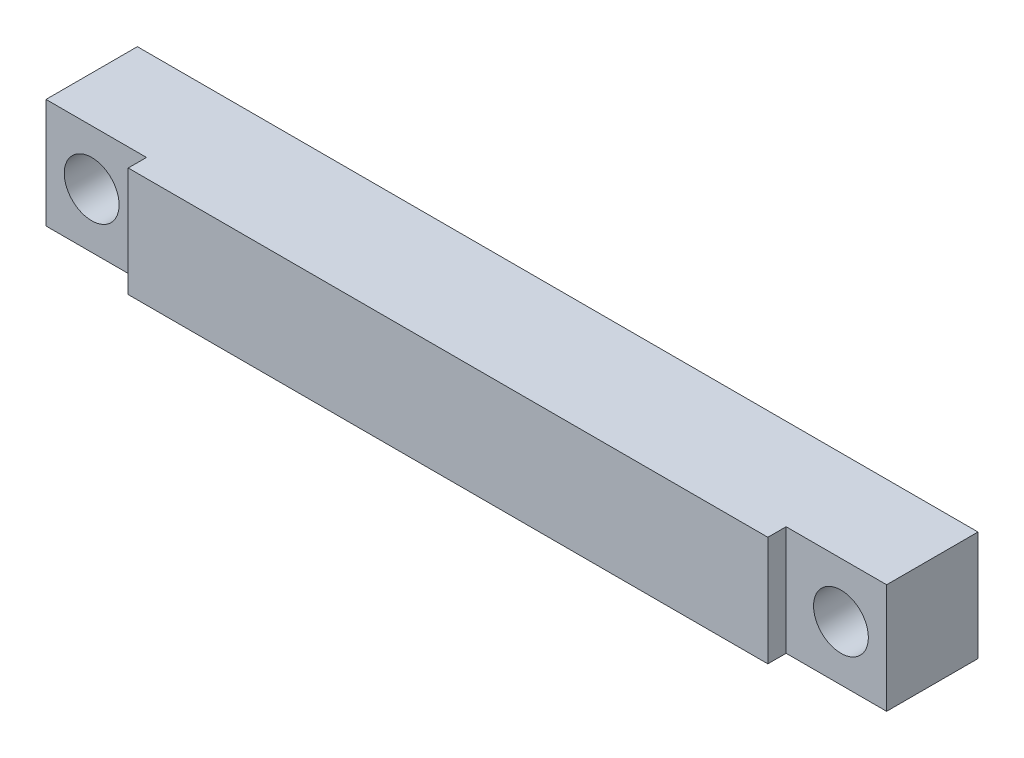
ISO-10303-21;
HEADER;
FILE_DESCRIPTION(('STEP AP214'),'2;1');
FILE_NAME('part.step','',(''),(''),'','','');
FILE_SCHEMA(('AUTOMOTIVE_DESIGN { 1 0 10303 214 1 1 1 1 }'));
ENDSEC;
DATA;
#1=APPLICATION_CONTEXT('core data for automotive mechanical design processes');
#2=APPLICATION_PROTOCOL_DEFINITION('international standard','automotive_design',2000,#1);
#3=PRODUCT_CONTEXT('',#1,'mechanical');
#4=PRODUCT('Part','Part','',(#3));
#5=PRODUCT_RELATED_PRODUCT_CATEGORY('part','',(#4));
#6=PRODUCT_DEFINITION_FORMATION('','',#4);
#7=PRODUCT_DEFINITION_CONTEXT('part definition',#1,'design');
#8=PRODUCT_DEFINITION('design','',#6,#7);
#9=PRODUCT_DEFINITION_SHAPE('','',#8);
#10=(LENGTH_UNIT() NAMED_UNIT(*) SI_UNIT(.MILLI.,.METRE.));
#11=(NAMED_UNIT(*) PLANE_ANGLE_UNIT() SI_UNIT($,.RADIAN.));
#12=(NAMED_UNIT(*) SI_UNIT($,.STERADIAN.) SOLID_ANGLE_UNIT());
#13=UNCERTAINTY_MEASURE_WITH_UNIT(LENGTH_MEASURE(1.E-05),#10,'distance_accuracy_value','');
#14=(GEOMETRIC_REPRESENTATION_CONTEXT(3) GLOBAL_UNCERTAINTY_ASSIGNED_CONTEXT((#13)) GLOBAL_UNIT_ASSIGNED_CONTEXT((#10,
#11,#12)) REPRESENTATION_CONTEXT('',''));
#15=CARTESIAN_POINT('',(0.,0.,0.));
#16=DIRECTION('',(0.,0.,1.));
#17=DIRECTION('',(1.,0.,0.));
#18=AXIS2_PLACEMENT_3D('',#15,#16,#17);
#19=CARTESIAN_POINT('',(0.,0.,5.));
#20=DIRECTION('',(0.,0.,1.));
#21=DIRECTION('',(1.,0.,0.));
#22=AXIS2_PLACEMENT_3D('',#19,#20,#21);
#23=PLANE('',#22);
#24=CARTESIAN_POINT('',(-20.5,0.,5.));
#25=DIRECTION('',(0.,0.,1.));
#26=DIRECTION('',(1.,0.,0.));
#27=AXIS2_PLACEMENT_3D('',#24,#25,#26);
#28=CIRCLE('',#27,1.5);
#29=CARTESIAN_POINT('',(-19.,0.,5.));
#30=VERTEX_POINT('',#29);
#31=EDGE_CURVE('E144',#30,#30,#28,.T.);
#32=ORIENTED_EDGE('',*,*,#31,.F.);
#33=EDGE_LOOP('',(#32));
#34=FACE_BOUND('',#33,.T.);
#35=DIRECTION('',(1.,0.,0.));
#36=VECTOR('',#35,1.);
#37=CARTESIAN_POINT('',(0.,-3.,5.));
#38=LINE('',#37,#36);
#39=CARTESIAN_POINT('',(-23.,-3.,5.));
#40=VERTEX_POINT('',#39);
#41=CARTESIAN_POINT('',(-17.5,-3.,5.));
#42=VERTEX_POINT('',#41);
#43=EDGE_CURVE('E149',#40,#42,#38,.T.);
#44=ORIENTED_EDGE('',*,*,#43,.T.);
#45=DIRECTION('',(0.,1.,0.));
#46=VECTOR('',#45,1.);
#47=CARTESIAN_POINT('',(-17.5,0.,5.));
#48=LINE('',#47,#46);
#49=CARTESIAN_POINT('',(-17.5,3.,5.));
#50=VERTEX_POINT('',#49);
#51=EDGE_CURVE('E64',#42,#50,#48,.T.);
#52=ORIENTED_EDGE('',*,*,#51,.T.);
#53=DIRECTION('',(1.,0.,0.));
#54=VECTOR('',#53,1.);
#55=CARTESIAN_POINT('',(0.,3.,5.));
#56=LINE('',#55,#54);
#57=CARTESIAN_POINT('',(-23.,3.,5.));
#58=VERTEX_POINT('',#57);
#59=EDGE_CURVE('E154',#58,#50,#56,.T.);
#60=ORIENTED_EDGE('',*,*,#59,.F.);
#61=DIRECTION('',(0.,-1.,0.));
#62=VECTOR('',#61,1.);
#63=CARTESIAN_POINT('',(-23.,0.,5.));
#64=LINE('',#63,#62);
#65=EDGE_CURVE('E156',#58,#40,#64,.T.);
#66=ORIENTED_EDGE('',*,*,#65,.T.);
#67=EDGE_LOOP('',(#44,#52,#60,#66));
#68=FACE_BOUND('',#67,.T.);
#69=ADVANCED_FACE('F41',(#34,#68),#23,.T.);
#70=CARTESIAN_POINT('',(0.,-3.,5.));
#71=DIRECTION('',(0.,1.,0.));
#72=DIRECTION('',(0.,0.,1.));
#73=AXIS2_PLACEMENT_3D('',#70,#71,#72);
#74=PLANE('',#73);
#75=CARTESIAN_POINT('',(17.5,-3.,5.));
#76=VERTEX_POINT('',#75);
#77=CARTESIAN_POINT('',(23.,-3.,5.));
#78=VERTEX_POINT('',#77);
#79=EDGE_CURVE('E147',#76,#78,#38,.T.);
#80=ORIENTED_EDGE('',*,*,#79,.F.);
#81=DIRECTION('',(0.,0.,-1.));
#82=VECTOR('',#81,1.);
#83=CARTESIAN_POINT('',(17.5,-3.,6.));
#84=LINE('',#83,#82);
#85=CARTESIAN_POINT('',(17.5,-3.,6.));
#86=VERTEX_POINT('',#85);
#87=EDGE_CURVE('E135',#86,#76,#84,.T.);
#88=ORIENTED_EDGE('',*,*,#87,.F.);
#89=DIRECTION('',(1.,0.,0.));
#90=VECTOR('',#89,1.);
#91=CARTESIAN_POINT('',(0.,-3.,6.));
#92=LINE('',#91,#90);
#93=CARTESIAN_POINT('',(-17.5,-3.,6.));
#94=VERTEX_POINT('',#93);
#95=EDGE_CURVE('E123',#94,#86,#92,.T.);
#96=ORIENTED_EDGE('',*,*,#95,.F.);
#97=DIRECTION('',(0.,0.,-1.));
#98=VECTOR('',#97,1.);
#99=CARTESIAN_POINT('',(-17.5,-3.,6.));
#100=LINE('',#99,#98);
#101=EDGE_CURVE('E137',#94,#42,#100,.T.);
#102=ORIENTED_EDGE('',*,*,#101,.T.);
#103=ORIENTED_EDGE('',*,*,#43,.F.);
#104=DIRECTION('',(0.,0.,-1.));
#105=VECTOR('',#104,1.);
#106=CARTESIAN_POINT('',(-23.,-3.,5.));
#107=LINE('',#106,#105);
#108=CARTESIAN_POINT('',(-23.,-3.,0.));
#109=VERTEX_POINT('',#108);
#110=EDGE_CURVE('E161',#40,#109,#107,.T.);
#111=ORIENTED_EDGE('',*,*,#110,.T.);
#112=DIRECTION('',(1.,0.,0.));
#113=VECTOR('',#112,1.);
#114=CARTESIAN_POINT('',(0.,-3.,0.));
#115=LINE('',#114,#113);
#116=CARTESIAN_POINT('',(23.,-3.,0.));
#117=VERTEX_POINT('',#116);
#118=EDGE_CURVE('E164',#109,#117,#115,.T.);
#119=ORIENTED_EDGE('',*,*,#118,.T.);
#120=DIRECTION('',(0.,0.,-1.));
#121=VECTOR('',#120,1.);
#122=CARTESIAN_POINT('',(23.,-3.,5.));
#123=LINE('',#122,#121);
#124=EDGE_CURVE('E11',#78,#117,#123,.T.);
#125=ORIENTED_EDGE('',*,*,#124,.F.);
#126=EDGE_LOOP('',(#80,#88,#96,#102,#103,#111,#119,#125));
#127=FACE_BOUND('',#126,.T.);
#128=ADVANCED_FACE('F195',(#127),#74,.F.);
#129=CARTESIAN_POINT('',(23.,0.,5.));
#130=DIRECTION('',(1.,0.,0.));
#131=DIRECTION('',(0.,0.,-1.));
#132=AXIS2_PLACEMENT_3D('',#129,#130,#131);
#133=PLANE('',#132);
#134=DIRECTION('',(0.,-1.,0.));
#135=VECTOR('',#134,1.);
#136=CARTESIAN_POINT('',(23.,0.,0.));
#137=LINE('',#136,#135);
#138=CARTESIAN_POINT('',(23.,3.,0.));
#139=VERTEX_POINT('',#138);
#140=EDGE_CURVE('E166',#139,#117,#137,.T.);
#141=ORIENTED_EDGE('',*,*,#140,.F.);
#142=DIRECTION('',(0.,0.,-1.));
#143=VECTOR('',#142,1.);
#144=CARTESIAN_POINT('',(23.,3.,5.));
#145=LINE('',#144,#143);
#146=CARTESIAN_POINT('',(23.,3.,5.));
#147=VERTEX_POINT('',#146);
#148=EDGE_CURVE('E49',#147,#139,#145,.T.);
#149=ORIENTED_EDGE('',*,*,#148,.F.);
#150=DIRECTION('',(0.,-1.,0.));
#151=VECTOR('',#150,1.);
#152=CARTESIAN_POINT('',(23.,0.,5.));
#153=LINE('',#152,#151);
#154=EDGE_CURVE('E151',#147,#78,#153,.T.);
#155=ORIENTED_EDGE('',*,*,#154,.T.);
#156=ORIENTED_EDGE('',*,*,#124,.T.);
#157=EDGE_LOOP('',(#141,#149,#155,#156));
#158=FACE_BOUND('',#157,.T.);
#159=ADVANCED_FACE('F182',(#158),#133,.T.);
#160=CARTESIAN_POINT('',(0.,3.,5.));
#161=DIRECTION('',(0.,1.,0.));
#162=DIRECTION('',(0.,0.,1.));
#163=AXIS2_PLACEMENT_3D('',#160,#161,#162);
#164=PLANE('',#163);
#165=ORIENTED_EDGE('',*,*,#148,.T.);
#166=DIRECTION('',(1.,0.,0.));
#167=VECTOR('',#166,1.);
#168=CARTESIAN_POINT('',(0.,3.,0.));
#169=LINE('',#168,#167);
#170=CARTESIAN_POINT('',(-23.,3.,0.));
#171=VERTEX_POINT('',#170);
#172=EDGE_CURVE('E169',#171,#139,#169,.T.);
#173=ORIENTED_EDGE('',*,*,#172,.F.);
#174=DIRECTION('',(0.,0.,-1.));
#175=VECTOR('',#174,1.);
#176=CARTESIAN_POINT('',(-23.,3.,5.));
#177=LINE('',#176,#175);
#178=EDGE_CURVE('E177',#58,#171,#177,.T.);
#179=ORIENTED_EDGE('',*,*,#178,.F.);
#180=ORIENTED_EDGE('',*,*,#59,.T.);
#181=DIRECTION('',(0.,0.,-1.));
#182=VECTOR('',#181,1.);
#183=CARTESIAN_POINT('',(-17.5,3.,6.));
#184=LINE('',#183,#182);
#185=CARTESIAN_POINT('',(-17.5,3.,6.));
#186=VERTEX_POINT('',#185);
#187=EDGE_CURVE('E116',#186,#50,#184,.T.);
#188=ORIENTED_EDGE('',*,*,#187,.F.);
#189=DIRECTION('',(1.,0.,0.));
#190=VECTOR('',#189,1.);
#191=CARTESIAN_POINT('',(0.,3.,6.));
#192=LINE('',#191,#190);
#193=CARTESIAN_POINT('',(17.5,3.,6.));
#194=VERTEX_POINT('',#193);
#195=EDGE_CURVE('E121',#186,#194,#192,.T.);
#196=ORIENTED_EDGE('',*,*,#195,.T.);
#197=DIRECTION('',(0.,0.,-1.));
#198=VECTOR('',#197,1.);
#199=CARTESIAN_POINT('',(17.5,3.,6.));
#200=LINE('',#199,#198);
#201=CARTESIAN_POINT('',(17.5,3.,5.));
#202=VERTEX_POINT('',#201);
#203=EDGE_CURVE('E108',#194,#202,#200,.T.);
#204=ORIENTED_EDGE('',*,*,#203,.T.);
#205=EDGE_CURVE('E56',#202,#147,#56,.T.);
#206=ORIENTED_EDGE('',*,*,#205,.T.);
#207=EDGE_LOOP('',(#165,#173,#179,#180,#188,#196,#204,#206));
#208=FACE_BOUND('',#207,.T.);
#209=ADVANCED_FACE('F127',(#208),#164,.T.);
#210=CARTESIAN_POINT('',(-23.,0.,5.));
#211=DIRECTION('',(1.,0.,0.));
#212=DIRECTION('',(0.,0.,-1.));
#213=AXIS2_PLACEMENT_3D('',#210,#211,#212);
#214=PLANE('',#213);
#215=DIRECTION('',(0.,-1.,0.));
#216=VECTOR('',#215,1.);
#217=CARTESIAN_POINT('',(-23.,0.,0.));
#218=LINE('',#217,#216);
#219=EDGE_CURVE('E171',#171,#109,#218,.T.);
#220=ORIENTED_EDGE('',*,*,#219,.T.);
#221=ORIENTED_EDGE('',*,*,#110,.F.);
#222=ORIENTED_EDGE('',*,*,#65,.F.);
#223=ORIENTED_EDGE('',*,*,#178,.T.);
#224=EDGE_LOOP('',(#220,#221,#222,#223));
#225=FACE_BOUND('',#224,.T.);
#226=ADVANCED_FACE('F191',(#225),#214,.F.);
#227=CARTESIAN_POINT('',(-20.5,0.,5.));
#228=DIRECTION('',(0.,0.,-1.));
#229=DIRECTION('',(-1.,0.,0.));
#230=AXIS2_PLACEMENT_3D('',#227,#228,#229);
#231=CYLINDRICAL_SURFACE('',#230,1.5);
#232=ORIENTED_EDGE('',*,*,#31,.T.);
#233=EDGE_LOOP('',(#232));
#234=FACE_BOUND('',#233,.T.);
#235=CARTESIAN_POINT('',(-20.5,0.,0.));
#236=DIRECTION('',(0.,0.,1.));
#237=DIRECTION('',(1.,0.,0.));
#238=AXIS2_PLACEMENT_3D('',#235,#236,#237);
#239=CIRCLE('',#238,1.5);
#240=CARTESIAN_POINT('',(-19.,0.,0.));
#241=VERTEX_POINT('',#240);
#242=EDGE_CURVE('E143',#241,#241,#239,.T.);
#243=ORIENTED_EDGE('',*,*,#242,.F.);
#244=EDGE_LOOP('',(#243));
#245=FACE_BOUND('',#244,.T.);
#246=ADVANCED_FACE('F43',(#234,#245),#231,.F.);
#247=CARTESIAN_POINT('',(20.5,0.,5.));
#248=DIRECTION('',(0.,0.,-1.));
#249=DIRECTION('',(-1.,0.,0.));
#250=AXIS2_PLACEMENT_3D('',#247,#248,#249);
#251=CYLINDRICAL_SURFACE('',#250,1.5);
#252=CARTESIAN_POINT('',(20.5,0.,5.));
#253=DIRECTION('',(0.,0.,1.));
#254=DIRECTION('',(1.,0.,0.));
#255=AXIS2_PLACEMENT_3D('',#252,#253,#254);
#256=CIRCLE('',#255,1.5);
#257=CARTESIAN_POINT('',(22.,0.,5.));
#258=VERTEX_POINT('',#257);
#259=EDGE_CURVE('E158',#258,#258,#256,.F.);
#260=ORIENTED_EDGE('',*,*,#259,.F.);
#261=EDGE_LOOP('',(#260));
#262=FACE_BOUND('',#261,.T.);
#263=CARTESIAN_POINT('',(20.5,0.,0.));
#264=DIRECTION('',(0.,0.,1.));
#265=DIRECTION('',(1.,0.,0.));
#266=AXIS2_PLACEMENT_3D('',#263,#264,#265);
#267=CIRCLE('',#266,1.5);
#268=CARTESIAN_POINT('',(22.,0.,0.));
#269=VERTEX_POINT('',#268);
#270=EDGE_CURVE('E148',#269,#269,#267,.F.);
#271=ORIENTED_EDGE('',*,*,#270,.T.);
#272=EDGE_LOOP('',(#271));
#273=FACE_BOUND('',#272,.T.);
#274=ADVANCED_FACE('F202',(#262,#273),#251,.F.);
#275=DIRECTION('',(0.,1.,0.));
#276=VECTOR('',#275,1.);
#277=CARTESIAN_POINT('',(17.5,0.,5.));
#278=LINE('',#277,#276);
#279=EDGE_CURVE('E113',#76,#202,#278,.T.);
#280=ORIENTED_EDGE('',*,*,#279,.F.);
#281=ORIENTED_EDGE('',*,*,#79,.T.);
#282=ORIENTED_EDGE('',*,*,#154,.F.);
#283=ORIENTED_EDGE('',*,*,#205,.F.);
#284=EDGE_LOOP('',(#280,#281,#282,#283));
#285=FACE_BOUND('',#284,.T.);
#286=ORIENTED_EDGE('',*,*,#259,.T.);
#287=EDGE_LOOP('',(#286));
#288=FACE_BOUND('',#287,.T.);
#289=ADVANCED_FACE('F199',(#285,#288),#23,.T.);
#290=CARTESIAN_POINT('',(0.,0.,0.));
#291=DIRECTION('',(0.,0.,1.));
#292=DIRECTION('',(1.,0.,0.));
#293=AXIS2_PLACEMENT_3D('',#290,#291,#292);
#294=PLANE('',#293);
#295=ORIENTED_EDGE('',*,*,#140,.T.);
#296=ORIENTED_EDGE('',*,*,#118,.F.);
#297=ORIENTED_EDGE('',*,*,#219,.F.);
#298=ORIENTED_EDGE('',*,*,#172,.T.);
#299=EDGE_LOOP('',(#295,#296,#297,#298));
#300=FACE_BOUND('',#299,.T.);
#301=ORIENTED_EDGE('',*,*,#270,.F.);
#302=EDGE_LOOP('',(#301));
#303=FACE_BOUND('',#302,.T.);
#304=ORIENTED_EDGE('',*,*,#242,.T.);
#305=EDGE_LOOP('',(#304));
#306=FACE_BOUND('',#305,.T.);
#307=ADVANCED_FACE('F186',(#300,#303,#306),#294,.F.);
#308=CARTESIAN_POINT('',(17.5,0.,6.));
#309=DIRECTION('',(1.,0.,0.));
#310=DIRECTION('',(0.,0.,-1.));
#311=AXIS2_PLACEMENT_3D('',#308,#309,#310);
#312=PLANE('',#311);
#313=ORIENTED_EDGE('',*,*,#87,.T.);
#314=ORIENTED_EDGE('',*,*,#279,.T.);
#315=ORIENTED_EDGE('',*,*,#203,.F.);
#316=DIRECTION('',(0.,-1.,0.));
#317=VECTOR('',#316,1.);
#318=CARTESIAN_POINT('',(17.5,0.,6.));
#319=LINE('',#318,#317);
#320=EDGE_CURVE('E112',#194,#86,#319,.T.);
#321=ORIENTED_EDGE('',*,*,#320,.T.);
#322=EDGE_LOOP('',(#313,#314,#315,#321));
#323=FACE_BOUND('',#322,.T.);
#324=ADVANCED_FACE('F111',(#323),#312,.T.);
#325=CARTESIAN_POINT('',(-17.5,0.,6.));
#326=DIRECTION('',(1.,0.,0.));
#327=DIRECTION('',(0.,0.,-1.));
#328=AXIS2_PLACEMENT_3D('',#325,#326,#327);
#329=PLANE('',#328);
#330=ORIENTED_EDGE('',*,*,#51,.F.);
#331=ORIENTED_EDGE('',*,*,#101,.F.);
#332=DIRECTION('',(0.,-1.,0.));
#333=VECTOR('',#332,1.);
#334=CARTESIAN_POINT('',(-17.5,0.,6.));
#335=LINE('',#334,#333);
#336=EDGE_CURVE('E130',#186,#94,#335,.T.);
#337=ORIENTED_EDGE('',*,*,#336,.F.);
#338=ORIENTED_EDGE('',*,*,#187,.T.);
#339=EDGE_LOOP('',(#330,#331,#337,#338));
#340=FACE_BOUND('',#339,.T.);
#341=ADVANCED_FACE('F198',(#340),#329,.F.);
#342=CARTESIAN_POINT('',(0.,0.,6.));
#343=DIRECTION('',(0.,0.,1.));
#344=DIRECTION('',(1.,0.,0.));
#345=AXIS2_PLACEMENT_3D('',#342,#343,#344);
#346=PLANE('',#345);
#347=ORIENTED_EDGE('',*,*,#320,.F.);
#348=ORIENTED_EDGE('',*,*,#195,.F.);
#349=ORIENTED_EDGE('',*,*,#336,.T.);
#350=ORIENTED_EDGE('',*,*,#95,.T.);
#351=EDGE_LOOP('',(#347,#348,#349,#350));
#352=FACE_BOUND('',#351,.T.);
#353=ADVANCED_FACE('F120',(#352),#346,.T.);
#354=CLOSED_SHELL('',(#69,#128,#159,#209,#226,#246,#274,#289,#307,#324,#341,#353));
#355=MANIFOLD_SOLID_BREP('B2',#354);
#356=ADVANCED_BREP_SHAPE_REPRESENTATION('',(#18,#355),#14);
#357=SHAPE_DEFINITION_REPRESENTATION(#9,#356);
ENDSEC;
END-ISO-10303-21;
